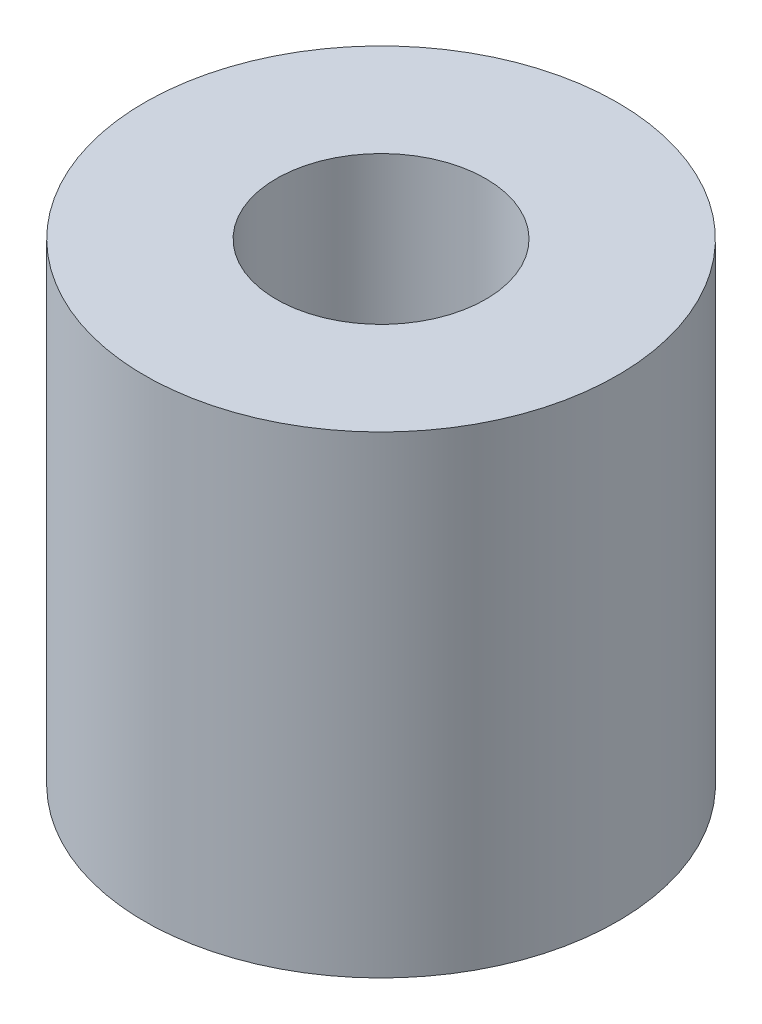
ISO-10303-21;
HEADER;
FILE_DESCRIPTION(('STEP AP214'),'2;1');
FILE_NAME('part.step','',(''),(''),'','','');
FILE_SCHEMA(('AUTOMOTIVE_DESIGN { 1 0 10303 214 1 1 1 1 }'));
ENDSEC;
DATA;
#1=APPLICATION_CONTEXT('core data for automotive mechanical design processes');
#2=APPLICATION_PROTOCOL_DEFINITION('international standard','automotive_design',2000,#1);
#3=PRODUCT_CONTEXT('',#1,'mechanical');
#4=PRODUCT('Part','Part','',(#3));
#5=PRODUCT_RELATED_PRODUCT_CATEGORY('part','',(#4));
#6=PRODUCT_DEFINITION_FORMATION('','',#4);
#7=PRODUCT_DEFINITION_CONTEXT('part definition',#1,'design');
#8=PRODUCT_DEFINITION('design','',#6,#7);
#9=PRODUCT_DEFINITION_SHAPE('','',#8);
#10=(LENGTH_UNIT() NAMED_UNIT(*) SI_UNIT(.MILLI.,.METRE.));
#11=(NAMED_UNIT(*) PLANE_ANGLE_UNIT() SI_UNIT($,.RADIAN.));
#12=(NAMED_UNIT(*) SI_UNIT($,.STERADIAN.) SOLID_ANGLE_UNIT());
#13=UNCERTAINTY_MEASURE_WITH_UNIT(LENGTH_MEASURE(1.E-05),#10,'distance_accuracy_value','');
#14=(GEOMETRIC_REPRESENTATION_CONTEXT(3) GLOBAL_UNCERTAINTY_ASSIGNED_CONTEXT((#13)) GLOBAL_UNIT_ASSIGNED_CONTEXT((#10,
#11,#12)) REPRESENTATION_CONTEXT('',''));
#15=CARTESIAN_POINT('',(0.,0.,0.));
#16=DIRECTION('',(0.,0.,1.));
#17=DIRECTION('',(1.,0.,0.));
#18=AXIS2_PLACEMENT_3D('',#15,#16,#17);
#19=CARTESIAN_POINT('',(0.,4.7625,0.));
#20=DIRECTION('',(0.,-1.,0.));
#21=DIRECTION('',(0.,0.,-1.));
#22=AXIS2_PLACEMENT_3D('',#19,#20,#21);
#23=CYLINDRICAL_SURFACE('',#22,2.1082);
#24=CARTESIAN_POINT('',(0.,-4.7625,0.));
#25=DIRECTION('',(0.,-1.,0.));
#26=DIRECTION('',(0.,0.,-1.));
#27=AXIS2_PLACEMENT_3D('',#24,#25,#26);
#28=CIRCLE('',#27,2.1082);
#29=CARTESIAN_POINT('',(0.,-4.7625,-2.1082));
#30=VERTEX_POINT('',#29);
#31=EDGE_CURVE('E26',#30,#30,#28,.T.);
#32=ORIENTED_EDGE('',*,*,#31,.T.);
#33=EDGE_LOOP('',(#32));
#34=FACE_BOUND('',#33,.T.);
#35=CARTESIAN_POINT('',(0.,4.7625,0.));
#36=DIRECTION('',(0.,-1.,0.));
#37=DIRECTION('',(0.,0.,-1.));
#38=AXIS2_PLACEMENT_3D('',#35,#36,#37);
#39=CIRCLE('',#38,2.1082);
#40=CARTESIAN_POINT('',(0.,4.7625,-2.1082));
#41=VERTEX_POINT('',#40);
#42=EDGE_CURVE('E17',#41,#41,#39,.T.);
#43=ORIENTED_EDGE('',*,*,#42,.F.);
#44=EDGE_LOOP('',(#43));
#45=FACE_BOUND('',#44,.T.);
#46=ADVANCED_FACE('F14',(#34,#45),#23,.F.);
#47=CARTESIAN_POINT('',(0.,4.7625,0.));
#48=DIRECTION('',(0.,1.,0.));
#49=DIRECTION('',(0.,0.,1.));
#50=AXIS2_PLACEMENT_3D('',#47,#48,#49);
#51=PLANE('',#50);
#52=ORIENTED_EDGE('',*,*,#42,.T.);
#53=EDGE_LOOP('',(#52));
#54=FACE_BOUND('',#53,.T.);
#55=CARTESIAN_POINT('',(0.,4.7625,0.));
#56=DIRECTION('',(0.,-1.,0.));
#57=DIRECTION('',(0.,0.,-1.));
#58=AXIS2_PLACEMENT_3D('',#55,#56,#57);
#59=CIRCLE('',#58,4.7625);
#60=CARTESIAN_POINT('',(0.,4.7625,-4.7625));
#61=VERTEX_POINT('',#60);
#62=EDGE_CURVE('E21',#61,#61,#59,.T.);
#63=ORIENTED_EDGE('',*,*,#62,.F.);
#64=EDGE_LOOP('',(#63));
#65=FACE_BOUND('',#64,.T.);
#66=ADVANCED_FACE('F34',(#54,#65),#51,.T.);
#67=CARTESIAN_POINT('',(0.,-4.7625,0.));
#68=DIRECTION('',(0.,1.,0.));
#69=DIRECTION('',(0.,0.,1.));
#70=AXIS2_PLACEMENT_3D('',#67,#68,#69);
#71=PLANE('',#70);
#72=ORIENTED_EDGE('',*,*,#31,.F.);
#73=EDGE_LOOP('',(#72));
#74=FACE_BOUND('',#73,.T.);
#75=CARTESIAN_POINT('',(0.,-4.7625,0.));
#76=DIRECTION('',(0.,-1.,0.));
#77=DIRECTION('',(0.,0.,-1.));
#78=AXIS2_PLACEMENT_3D('',#75,#76,#77);
#79=CIRCLE('',#78,4.7625);
#80=CARTESIAN_POINT('',(0.,-4.7625,-4.7625));
#81=VERTEX_POINT('',#80);
#82=EDGE_CURVE('E10',#81,#81,#79,.F.);
#83=ORIENTED_EDGE('',*,*,#82,.F.);
#84=EDGE_LOOP('',(#83));
#85=FACE_BOUND('',#84,.T.);
#86=ADVANCED_FACE('F42',(#74,#85),#71,.F.);
#87=CARTESIAN_POINT('',(0.,4.7625,0.));
#88=DIRECTION('',(0.,-1.,0.));
#89=DIRECTION('',(0.,0.,-1.));
#90=AXIS2_PLACEMENT_3D('',#87,#88,#89);
#91=CYLINDRICAL_SURFACE('',#90,4.7625);
#92=ORIENTED_EDGE('',*,*,#82,.T.);
#93=EDGE_LOOP('',(#92));
#94=FACE_BOUND('',#93,.T.);
#95=ORIENTED_EDGE('',*,*,#62,.T.);
#96=EDGE_LOOP('',(#95));
#97=FACE_BOUND('',#96,.T.);
#98=ADVANCED_FACE('F43',(#94,#97),#91,.T.);
#99=CLOSED_SHELL('',(#46,#66,#86,#98));
#100=MANIFOLD_SOLID_BREP('B1',#99);
#101=ADVANCED_BREP_SHAPE_REPRESENTATION('',(#18,#100),#14);
#102=SHAPE_DEFINITION_REPRESENTATION(#9,#101);
ENDSEC;
END-ISO-10303-21;
